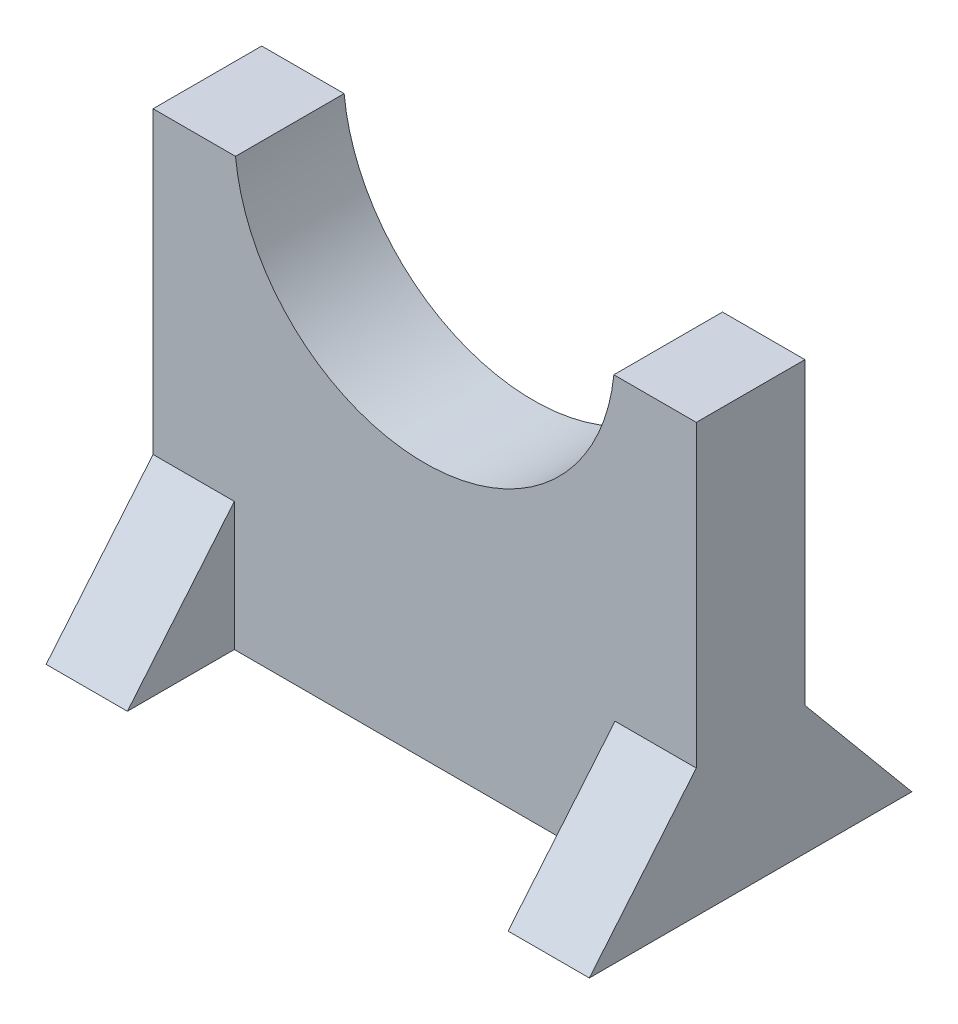
ISO-10303-21;
HEADER;
FILE_DESCRIPTION(('STEP AP214'),'2;1');
FILE_NAME('part.step','',(''),(''),'','','');
FILE_SCHEMA(('AUTOMOTIVE_DESIGN { 1 0 10303 214 1 1 1 1 }'));
ENDSEC;
DATA;
#1=APPLICATION_CONTEXT('core data for automotive mechanical design processes');
#2=APPLICATION_PROTOCOL_DEFINITION('international standard','automotive_design',2000,#1);
#3=PRODUCT_CONTEXT('',#1,'mechanical');
#4=PRODUCT('Part','Part','',(#3));
#5=PRODUCT_RELATED_PRODUCT_CATEGORY('part','',(#4));
#6=PRODUCT_DEFINITION_FORMATION('','',#4);
#7=PRODUCT_DEFINITION_CONTEXT('part definition',#1,'design');
#8=PRODUCT_DEFINITION('design','',#6,#7);
#9=PRODUCT_DEFINITION_SHAPE('','',#8);
#10=(LENGTH_UNIT() NAMED_UNIT(*) SI_UNIT(.MILLI.,.METRE.));
#11=(NAMED_UNIT(*) PLANE_ANGLE_UNIT() SI_UNIT($,.RADIAN.));
#12=(NAMED_UNIT(*) SI_UNIT($,.STERADIAN.) SOLID_ANGLE_UNIT());
#13=UNCERTAINTY_MEASURE_WITH_UNIT(LENGTH_MEASURE(1.E-05),#10,'distance_accuracy_value','');
#14=(GEOMETRIC_REPRESENTATION_CONTEXT(3) GLOBAL_UNCERTAINTY_ASSIGNED_CONTEXT((#13)) GLOBAL_UNIT_ASSIGNED_CONTEXT((#10,
#11,#12)) REPRESENTATION_CONTEXT('',''));
#15=CARTESIAN_POINT('',(0.,0.,0.));
#16=DIRECTION('',(0.,0.,1.));
#17=DIRECTION('',(1.,0.,0.));
#18=AXIS2_PLACEMENT_3D('',#15,#16,#17);
#19=CARTESIAN_POINT('',(-63.5,100.,12.7));
#20=DIRECTION('',(0.,0.,-1.));
#21=DIRECTION('',(-1.,0.,0.));
#22=AXIS2_PLACEMENT_3D('',#19,#20,#21);
#23=PLANE('',#22);
#24=DIRECTION('',(0.,-1.,0.));
#25=VECTOR('',#24,1.);
#26=CARTESIAN_POINT('',(44.5,30.,12.7));
#27=LINE('',#26,#25);
#28=CARTESIAN_POINT('',(44.5,30.,12.7));
#29=VERTEX_POINT('',#28);
#30=CARTESIAN_POINT('',(44.5,0.,12.7));
#31=VERTEX_POINT('',#30);
#32=EDGE_CURVE('E206',#29,#31,#27,.T.);
#33=ORIENTED_EDGE('',*,*,#32,.F.);
#34=DIRECTION('',(-1.,0.,0.));
#35=VECTOR('',#34,1.);
#36=CARTESIAN_POINT('',(63.5,30.,12.7));
#37=LINE('',#36,#35);
#38=CARTESIAN_POINT('',(63.5,30.,12.7));
#39=VERTEX_POINT('',#38);
#40=EDGE_CURVE('E219',#39,#29,#37,.T.);
#41=ORIENTED_EDGE('',*,*,#40,.F.);
#42=DIRECTION('',(0.,-1.,0.));
#43=VECTOR('',#42,1.);
#44=CARTESIAN_POINT('',(63.5,100.,12.7));
#45=LINE('',#44,#43);
#46=CARTESIAN_POINT('',(63.5,100.,12.7));
#47=VERTEX_POINT('',#46);
#48=EDGE_CURVE('E159',#47,#39,#45,.T.);
#49=ORIENTED_EDGE('',*,*,#48,.F.);
#50=DIRECTION('',(1.,0.,0.));
#51=VECTOR('',#50,1.);
#52=CARTESIAN_POINT('',(-63.5,100.,12.7));
#53=LINE('',#52,#51);
#54=CARTESIAN_POINT('',(44.226688774992,100.,12.7));
#55=VERTEX_POINT('',#54);
#56=EDGE_CURVE('E195',#55,#47,#53,.T.);
#57=ORIENTED_EDGE('',*,*,#56,.F.);
#58=CARTESIAN_POINT('',(0.,104.45,12.7));
#59=DIRECTION('',(0.,0.,1.));
#60=DIRECTION('',(1.,0.,0.));
#61=AXIS2_PLACEMENT_3D('',#58,#59,#60);
#62=CIRCLE('',#61,44.45);
#63=CARTESIAN_POINT('',(-44.226688774992,100.,12.7));
#64=VERTEX_POINT('',#63);
#65=EDGE_CURVE('E175',#64,#55,#62,.T.);
#66=ORIENTED_EDGE('',*,*,#65,.F.);
#67=CARTESIAN_POINT('',(-63.5,100.,12.7));
#68=VERTEX_POINT('',#67);
#69=EDGE_CURVE('E157',#68,#64,#53,.T.);
#70=ORIENTED_EDGE('',*,*,#69,.F.);
#71=DIRECTION('',(0.,-1.,0.));
#72=VECTOR('',#71,1.);
#73=CARTESIAN_POINT('',(-63.5,100.,12.7));
#74=LINE('',#73,#72);
#75=CARTESIAN_POINT('',(-63.5,30.,12.7));
#76=VERTEX_POINT('',#75);
#77=EDGE_CURVE('E146',#68,#76,#74,.T.);
#78=ORIENTED_EDGE('',*,*,#77,.T.);
#79=DIRECTION('',(-1.,0.,0.));
#80=VECTOR('',#79,1.);
#81=CARTESIAN_POINT('',(-63.5,30.,12.7));
#82=LINE('',#81,#80);
#83=CARTESIAN_POINT('',(-44.5,30.,12.7));
#84=VERTEX_POINT('',#83);
#85=EDGE_CURVE('E130',#84,#76,#82,.T.);
#86=ORIENTED_EDGE('',*,*,#85,.F.);
#87=DIRECTION('',(0.,-1.,0.));
#88=VECTOR('',#87,1.);
#89=CARTESIAN_POINT('',(-44.5,30.,12.7));
#90=LINE('',#89,#88);
#91=CARTESIAN_POINT('',(-44.5,0.,12.7));
#92=VERTEX_POINT('',#91);
#93=EDGE_CURVE('E139',#84,#92,#90,.T.);
#94=ORIENTED_EDGE('',*,*,#93,.T.);
#95=DIRECTION('',(1.,0.,0.));
#96=VECTOR('',#95,1.);
#97=CARTESIAN_POINT('',(-63.5,0.,12.7));
#98=LINE('',#97,#96);
#99=EDGE_CURVE('E204',#92,#31,#98,.T.);
#100=ORIENTED_EDGE('',*,*,#99,.T.);
#101=EDGE_LOOP('',(#33,#41,#49,#57,#66,#70,#78,#86,#94,#100));
#102=FACE_BOUND('',#101,.T.);
#103=ADVANCED_FACE('F33',(#102),#23,.F.);
#104=CARTESIAN_POINT('',(-63.5,100.,-12.7));
#105=DIRECTION('',(0.,0.,1.));
#106=DIRECTION('',(1.,0.,0.));
#107=AXIS2_PLACEMENT_3D('',#104,#105,#106);
#108=PLANE('',#107);
#109=DIRECTION('',(0.,-1.,0.));
#110=VECTOR('',#109,1.);
#111=CARTESIAN_POINT('',(-44.5,30.,-12.7));
#112=LINE('',#111,#110);
#113=CARTESIAN_POINT('',(-44.5,30.,-12.7));
#114=VERTEX_POINT('',#113);
#115=CARTESIAN_POINT('',(-44.5,0.,-12.7));
#116=VERTEX_POINT('',#115);
#117=EDGE_CURVE('E241',#114,#116,#112,.T.);
#118=ORIENTED_EDGE('',*,*,#117,.F.);
#119=DIRECTION('',(1.,0.,0.));
#120=VECTOR('',#119,1.);
#121=CARTESIAN_POINT('',(-63.5,30.,-12.7));
#122=LINE('',#121,#120);
#123=CARTESIAN_POINT('',(-63.5,30.,-12.7));
#124=VERTEX_POINT('',#123);
#125=EDGE_CURVE('E239',#124,#114,#122,.T.);
#126=ORIENTED_EDGE('',*,*,#125,.F.);
#127=DIRECTION('',(0.,-1.,0.));
#128=VECTOR('',#127,1.);
#129=CARTESIAN_POINT('',(-63.5,100.,-12.7));
#130=LINE('',#129,#128);
#131=CARTESIAN_POINT('',(-63.5,100.,-12.7));
#132=VERTEX_POINT('',#131);
#133=EDGE_CURVE('E158',#132,#124,#130,.T.);
#134=ORIENTED_EDGE('',*,*,#133,.F.);
#135=DIRECTION('',(-1.,0.,0.));
#136=VECTOR('',#135,1.);
#137=CARTESIAN_POINT('',(-63.5,100.,-12.7));
#138=LINE('',#137,#136);
#139=CARTESIAN_POINT('',(-44.226688774992,100.,-12.7));
#140=VERTEX_POINT('',#139);
#141=EDGE_CURVE('E186',#140,#132,#138,.T.);
#142=ORIENTED_EDGE('',*,*,#141,.F.);
#143=CARTESIAN_POINT('',(0.,104.45,-12.7));
#144=DIRECTION('',(0.,0.,1.));
#145=DIRECTION('',(1.,0.,0.));
#146=AXIS2_PLACEMENT_3D('',#143,#144,#145);
#147=CIRCLE('',#146,44.45);
#148=CARTESIAN_POINT('',(44.226688774992,100.,-12.7));
#149=VERTEX_POINT('',#148);
#150=EDGE_CURVE('E173',#140,#149,#147,.T.);
#151=ORIENTED_EDGE('',*,*,#150,.T.);
#152=CARTESIAN_POINT('',(63.5,100.,-12.7));
#153=VERTEX_POINT('',#152);
#154=EDGE_CURVE('E183',#153,#149,#138,.T.);
#155=ORIENTED_EDGE('',*,*,#154,.F.);
#156=DIRECTION('',(0.,-1.,0.));
#157=VECTOR('',#156,1.);
#158=CARTESIAN_POINT('',(63.5,100.,-12.7));
#159=LINE('',#158,#157);
#160=CARTESIAN_POINT('',(63.5,30.,-12.7));
#161=VERTEX_POINT('',#160);
#162=EDGE_CURVE('E162',#153,#161,#159,.T.);
#163=ORIENTED_EDGE('',*,*,#162,.T.);
#164=DIRECTION('',(1.,0.,0.));
#165=VECTOR('',#164,1.);
#166=CARTESIAN_POINT('',(63.5,30.,-12.7));
#167=LINE('',#166,#165);
#168=CARTESIAN_POINT('',(44.5,30.,-12.7));
#169=VERTEX_POINT('',#168);
#170=EDGE_CURVE('E229',#169,#161,#167,.T.);
#171=ORIENTED_EDGE('',*,*,#170,.F.);
#172=DIRECTION('',(0.,-1.,0.));
#173=VECTOR('',#172,1.);
#174=CARTESIAN_POINT('',(44.5,30.,-12.7));
#175=LINE('',#174,#173);
#176=CARTESIAN_POINT('',(44.5,0.,-12.7));
#177=VERTEX_POINT('',#176);
#178=EDGE_CURVE('E231',#169,#177,#175,.T.);
#179=ORIENTED_EDGE('',*,*,#178,.T.);
#180=DIRECTION('',(-1.,0.,0.));
#181=VECTOR('',#180,1.);
#182=CARTESIAN_POINT('',(-63.5,0.,-12.7));
#183=LINE('',#182,#181);
#184=EDGE_CURVE('E202',#177,#116,#183,.T.);
#185=ORIENTED_EDGE('',*,*,#184,.T.);
#186=EDGE_LOOP('',(#118,#126,#134,#142,#151,#155,#163,#171,#179,#185));
#187=FACE_BOUND('',#186,.T.);
#188=ADVANCED_FACE('F182',(#187),#108,.F.);
#189=CARTESIAN_POINT('',(0.,100.,0.));
#190=DIRECTION('',(0.,1.,0.));
#191=DIRECTION('',(0.,0.,1.));
#192=AXIS2_PLACEMENT_3D('',#189,#190,#191);
#193=PLANE('',#192);
#194=DIRECTION('',(0.,0.,1.));
#195=VECTOR('',#194,1.);
#196=CARTESIAN_POINT('',(-44.226688774992,100.,-17.3));
#197=LINE('',#196,#195);
#198=EDGE_CURVE('E11',#140,#64,#197,.T.);
#199=ORIENTED_EDGE('',*,*,#198,.F.);
#200=ORIENTED_EDGE('',*,*,#141,.T.);
#201=DIRECTION('',(0.,0.,1.));
#202=VECTOR('',#201,1.);
#203=CARTESIAN_POINT('',(-63.5,100.,-12.7));
#204=LINE('',#203,#202);
#205=EDGE_CURVE('E193',#132,#68,#204,.T.);
#206=ORIENTED_EDGE('',*,*,#205,.T.);
#207=ORIENTED_EDGE('',*,*,#69,.T.);
#208=EDGE_LOOP('',(#199,#200,#206,#207));
#209=FACE_BOUND('',#208,.T.);
#210=ADVANCED_FACE('F290',(#209),#193,.T.);
#211=CARTESIAN_POINT('',(63.5,100.,-12.7));
#212=DIRECTION('',(-1.,0.,0.));
#213=DIRECTION('',(0.,0.,1.));
#214=AXIS2_PLACEMENT_3D('',#211,#212,#213);
#215=PLANE('',#214);
#216=ORIENTED_EDGE('',*,*,#48,.T.);
#217=DIRECTION('',(0.,-0.768221279597376,0.64018439966448));
#218=VECTOR('',#217,1.);
#219=CARTESIAN_POINT('',(63.5,83.8032786885246,-32.1360655737705));
#220=LINE('',#219,#218);
#221=CARTESIAN_POINT('',(63.5,0.,37.7));
#222=VERTEX_POINT('',#221);
#223=EDGE_CURVE('E56',#39,#222,#220,.T.);
#224=ORIENTED_EDGE('',*,*,#223,.T.);
#225=DIRECTION('',(0.,0.,-1.));
#226=VECTOR('',#225,1.);
#227=CARTESIAN_POINT('',(63.5,0.,-12.7));
#228=LINE('',#227,#226);
#229=CARTESIAN_POINT('',(63.5,0.,-37.7));
#230=VERTEX_POINT('',#229);
#231=EDGE_CURVE('E187',#222,#230,#228,.T.);
#232=ORIENTED_EDGE('',*,*,#231,.T.);
#233=DIRECTION('',(0.,0.768221279597376,0.64018439966448));
#234=VECTOR('',#233,1.);
#235=CARTESIAN_POINT('',(63.5,71.3114754098361,21.7262295081967));
#236=LINE('',#235,#234);
#237=EDGE_CURVE('E267',#230,#161,#236,.T.);
#238=ORIENTED_EDGE('',*,*,#237,.T.);
#239=ORIENTED_EDGE('',*,*,#162,.F.);
#240=DIRECTION('',(0.,0.,-1.));
#241=VECTOR('',#240,1.);
#242=CARTESIAN_POINT('',(63.5,100.,-12.7));
#243=LINE('',#242,#241);
#244=EDGE_CURVE('E191',#47,#153,#243,.T.);
#245=ORIENTED_EDGE('',*,*,#244,.F.);
#246=EDGE_LOOP('',(#216,#224,#232,#238,#239,#245));
#247=FACE_BOUND('',#246,.T.);
#248=ADVANCED_FACE('F35',(#247),#215,.F.);
#249=CARTESIAN_POINT('',(-63.5,100.,-12.7));
#250=DIRECTION('',(1.,0.,0.));
#251=DIRECTION('',(0.,0.,-1.));
#252=AXIS2_PLACEMENT_3D('',#249,#250,#251);
#253=PLANE('',#252);
#254=DIRECTION('',(0.,0.,1.));
#255=VECTOR('',#254,1.);
#256=CARTESIAN_POINT('',(-63.5,0.,-12.7));
#257=LINE('',#256,#255);
#258=CARTESIAN_POINT('',(-63.5,0.,-37.7));
#259=VERTEX_POINT('',#258);
#260=CARTESIAN_POINT('',(-63.5,0.,37.7));
#261=VERTEX_POINT('',#260);
#262=EDGE_CURVE('E150',#259,#261,#257,.T.);
#263=ORIENTED_EDGE('',*,*,#262,.T.);
#264=DIRECTION('',(0.,-0.768221279597376,0.64018439966448));
#265=VECTOR('',#264,1.);
#266=CARTESIAN_POINT('',(-63.5,30.,12.7));
#267=LINE('',#266,#265);
#268=EDGE_CURVE('E133',#76,#261,#267,.T.);
#269=ORIENTED_EDGE('',*,*,#268,.F.);
#270=ORIENTED_EDGE('',*,*,#77,.F.);
#271=ORIENTED_EDGE('',*,*,#205,.F.);
#272=ORIENTED_EDGE('',*,*,#133,.T.);
#273=DIRECTION('',(0.,0.768221279597376,0.64018439966448));
#274=VECTOR('',#273,1.);
#275=CARTESIAN_POINT('',(-63.5,30.,-12.7));
#276=LINE('',#275,#274);
#277=EDGE_CURVE('E152',#259,#124,#276,.T.);
#278=ORIENTED_EDGE('',*,*,#277,.F.);
#279=EDGE_LOOP('',(#263,#269,#270,#271,#272,#278));
#280=FACE_BOUND('',#279,.T.);
#281=ADVANCED_FACE('F144',(#280),#253,.F.);
#282=DIRECTION('',(0.,0.,1.));
#283=VECTOR('',#282,1.);
#284=CARTESIAN_POINT('',(44.226688774992,100.,-17.3));
#285=LINE('',#284,#283);
#286=EDGE_CURVE('E41',#55,#149,#285,.F.);
#287=ORIENTED_EDGE('',*,*,#286,.F.);
#288=ORIENTED_EDGE('',*,*,#56,.T.);
#289=ORIENTED_EDGE('',*,*,#244,.T.);
#290=ORIENTED_EDGE('',*,*,#154,.T.);
#291=EDGE_LOOP('',(#287,#288,#289,#290));
#292=FACE_BOUND('',#291,.T.);
#293=ADVANCED_FACE('F189',(#292),#193,.T.);
#294=CARTESIAN_POINT('',(0.,0.,0.));
#295=DIRECTION('',(0.,1.,0.));
#296=DIRECTION('',(0.,0.,1.));
#297=AXIS2_PLACEMENT_3D('',#294,#295,#296);
#298=PLANE('',#297);
#299=ORIENTED_EDGE('',*,*,#231,.F.);
#300=DIRECTION('',(1.,0.,0.));
#301=VECTOR('',#300,1.);
#302=CARTESIAN_POINT('',(63.5,0.,37.7));
#303=LINE('',#302,#301);
#304=CARTESIAN_POINT('',(44.5,0.,37.7));
#305=VERTEX_POINT('',#304);
#306=EDGE_CURVE('E223',#305,#222,#303,.T.);
#307=ORIENTED_EDGE('',*,*,#306,.F.);
#308=DIRECTION('',(0.,0.,1.));
#309=VECTOR('',#308,1.);
#310=CARTESIAN_POINT('',(44.5,0.,12.7));
#311=LINE('',#310,#309);
#312=EDGE_CURVE('E215',#31,#305,#311,.T.);
#313=ORIENTED_EDGE('',*,*,#312,.F.);
#314=ORIENTED_EDGE('',*,*,#99,.F.);
#315=DIRECTION('',(0.,0.,-1.));
#316=VECTOR('',#315,1.);
#317=CARTESIAN_POINT('',(-44.5,0.,12.7));
#318=LINE('',#317,#316);
#319=CARTESIAN_POINT('',(-44.5,0.,37.7));
#320=VERTEX_POINT('',#319);
#321=EDGE_CURVE('E140',#320,#92,#318,.T.);
#322=ORIENTED_EDGE('',*,*,#321,.F.);
#323=DIRECTION('',(1.,0.,0.));
#324=VECTOR('',#323,1.);
#325=CARTESIAN_POINT('',(-63.5,0.,37.7));
#326=LINE('',#325,#324);
#327=EDGE_CURVE('E269',#261,#320,#326,.T.);
#328=ORIENTED_EDGE('',*,*,#327,.F.);
#329=ORIENTED_EDGE('',*,*,#262,.F.);
#330=DIRECTION('',(-1.,0.,0.));
#331=VECTOR('',#330,1.);
#332=CARTESIAN_POINT('',(-63.5,0.,-37.7));
#333=LINE('',#332,#331);
#334=CARTESIAN_POINT('',(-44.5,0.,-37.7));
#335=VERTEX_POINT('',#334);
#336=EDGE_CURVE('E242',#335,#259,#333,.T.);
#337=ORIENTED_EDGE('',*,*,#336,.F.);
#338=DIRECTION('',(0.,0.,-1.));
#339=VECTOR('',#338,1.);
#340=CARTESIAN_POINT('',(-44.5,0.,-12.7));
#341=LINE('',#340,#339);
#342=EDGE_CURVE('E238',#116,#335,#341,.T.);
#343=ORIENTED_EDGE('',*,*,#342,.F.);
#344=ORIENTED_EDGE('',*,*,#184,.F.);
#345=DIRECTION('',(0.,0.,1.));
#346=VECTOR('',#345,1.);
#347=CARTESIAN_POINT('',(44.5,0.,-12.7));
#348=LINE('',#347,#346);
#349=CARTESIAN_POINT('',(44.5,0.,-37.7));
#350=VERTEX_POINT('',#349);
#351=EDGE_CURVE('E232',#350,#177,#348,.T.);
#352=ORIENTED_EDGE('',*,*,#351,.F.);
#353=DIRECTION('',(-1.,0.,0.));
#354=VECTOR('',#353,1.);
#355=CARTESIAN_POINT('',(63.5,0.,-37.7));
#356=LINE('',#355,#354);
#357=EDGE_CURVE('E218',#230,#350,#356,.T.);
#358=ORIENTED_EDGE('',*,*,#357,.F.);
#359=EDGE_LOOP('',(#299,#307,#313,#314,#322,#328,#329,#337,#343,#344,#352,#358));
#360=FACE_BOUND('',#359,.T.);
#361=ADVANCED_FACE('F222',(#360),#298,.F.);
#362=CARTESIAN_POINT('',(0.,104.45,-17.3));
#363=DIRECTION('',(0.,0.,1.));
#364=DIRECTION('',(1.,0.,0.));
#365=AXIS2_PLACEMENT_3D('',#362,#363,#364);
#366=CYLINDRICAL_SURFACE('',#365,44.45);
#367=ORIENTED_EDGE('',*,*,#198,.T.);
#368=ORIENTED_EDGE('',*,*,#65,.T.);
#369=ORIENTED_EDGE('',*,*,#286,.T.);
#370=ORIENTED_EDGE('',*,*,#150,.F.);
#371=EDGE_LOOP('',(#367,#368,#369,#370));
#372=FACE_BOUND('',#371,.T.);
#373=ADVANCED_FACE('F172',(#372),#366,.F.);
#374=CARTESIAN_POINT('',(-44.5,30.,-12.7));
#375=DIRECTION('',(-1.,0.,0.));
#376=DIRECTION('',(0.,0.,1.));
#377=AXIS2_PLACEMENT_3D('',#374,#375,#376);
#378=PLANE('',#377);
#379=ORIENTED_EDGE('',*,*,#342,.T.);
#380=DIRECTION('',(0.,0.768221279597376,0.64018439966448));
#381=VECTOR('',#380,1.);
#382=CARTESIAN_POINT('',(-44.5,30.,-12.7));
#383=LINE('',#382,#381);
#384=EDGE_CURVE('E253',#335,#114,#383,.T.);
#385=ORIENTED_EDGE('',*,*,#384,.T.);
#386=ORIENTED_EDGE('',*,*,#117,.T.);
#387=EDGE_LOOP('',(#379,#385,#386));
#388=FACE_BOUND('',#387,.T.);
#389=ADVANCED_FACE('F251',(#388),#378,.F.);
#390=CARTESIAN_POINT('',(44.5,30.,-12.7));
#391=DIRECTION('',(1.,0.,0.));
#392=DIRECTION('',(0.,0.,-1.));
#393=AXIS2_PLACEMENT_3D('',#390,#391,#392);
#394=PLANE('',#393);
#395=ORIENTED_EDGE('',*,*,#178,.F.);
#396=DIRECTION('',(0.,-0.768221279597376,-0.64018439966448));
#397=VECTOR('',#396,1.);
#398=CARTESIAN_POINT('',(44.5,30.,-12.7));
#399=LINE('',#398,#397);
#400=EDGE_CURVE('E263',#169,#350,#399,.T.);
#401=ORIENTED_EDGE('',*,*,#400,.T.);
#402=ORIENTED_EDGE('',*,*,#351,.T.);
#403=EDGE_LOOP('',(#395,#401,#402));
#404=FACE_BOUND('',#403,.T.);
#405=ADVANCED_FACE('F282',(#404),#394,.F.);
#406=CARTESIAN_POINT('',(44.5,30.,12.7));
#407=DIRECTION('',(1.,0.,0.));
#408=DIRECTION('',(0.,0.,-1.));
#409=AXIS2_PLACEMENT_3D('',#406,#407,#408);
#410=PLANE('',#409);
#411=ORIENTED_EDGE('',*,*,#312,.T.);
#412=DIRECTION('',(0.,0.768221279597376,-0.64018439966448));
#413=VECTOR('',#412,1.);
#414=CARTESIAN_POINT('',(44.5,30.,12.7));
#415=LINE('',#414,#413);
#416=EDGE_CURVE('E217',#305,#29,#415,.T.);
#417=ORIENTED_EDGE('',*,*,#416,.T.);
#418=ORIENTED_EDGE('',*,*,#32,.T.);
#419=EDGE_LOOP('',(#411,#417,#418));
#420=FACE_BOUND('',#419,.T.);
#421=ADVANCED_FACE('F214',(#420),#410,.F.);
#422=CARTESIAN_POINT('',(-44.5,30.,12.7));
#423=DIRECTION('',(-1.,0.,0.));
#424=DIRECTION('',(0.,0.,1.));
#425=AXIS2_PLACEMENT_3D('',#422,#423,#424);
#426=PLANE('',#425);
#427=ORIENTED_EDGE('',*,*,#93,.F.);
#428=DIRECTION('',(0.,-0.768221279597376,0.64018439966448));
#429=VECTOR('',#428,1.);
#430=CARTESIAN_POINT('',(-44.5,30.,12.7));
#431=LINE('',#430,#429);
#432=EDGE_CURVE('E48',#84,#320,#431,.T.);
#433=ORIENTED_EDGE('',*,*,#432,.T.);
#434=ORIENTED_EDGE('',*,*,#321,.T.);
#435=EDGE_LOOP('',(#427,#433,#434));
#436=FACE_BOUND('',#435,.T.);
#437=ADVANCED_FACE('F273',(#436),#426,.F.);
#438=CARTESIAN_POINT('',(76.5,30.,12.7));
#439=DIRECTION('',(0.,-0.64018439966448,-0.768221279597376));
#440=DIRECTION('',(0.,0.768221279597376,-0.64018439966448));
#441=AXIS2_PLACEMENT_3D('',#438,#439,#440);
#442=PLANE('',#441);
#443=ORIENTED_EDGE('',*,*,#85,.T.);
#444=ORIENTED_EDGE('',*,*,#268,.T.);
#445=ORIENTED_EDGE('',*,*,#327,.T.);
#446=ORIENTED_EDGE('',*,*,#432,.F.);
#447=EDGE_LOOP('',(#443,#444,#445,#446));
#448=FACE_BOUND('',#447,.T.);
#449=ADVANCED_FACE('F132',(#448),#442,.F.);
#450=ORIENTED_EDGE('',*,*,#40,.T.);
#451=ORIENTED_EDGE('',*,*,#416,.F.);
#452=ORIENTED_EDGE('',*,*,#306,.T.);
#453=ORIENTED_EDGE('',*,*,#223,.F.);
#454=EDGE_LOOP('',(#450,#451,#452,#453));
#455=FACE_BOUND('',#454,.T.);
#456=ADVANCED_FACE('F280',(#455),#442,.F.);
#457=CARTESIAN_POINT('',(76.5,30.,-12.7));
#458=DIRECTION('',(0.,-0.64018439966448,0.768221279597376));
#459=DIRECTION('',(0.,-0.768221279597376,-0.64018439966448));
#460=AXIS2_PLACEMENT_3D('',#457,#458,#459);
#461=PLANE('',#460);
#462=ORIENTED_EDGE('',*,*,#357,.T.);
#463=ORIENTED_EDGE('',*,*,#400,.F.);
#464=ORIENTED_EDGE('',*,*,#170,.T.);
#465=ORIENTED_EDGE('',*,*,#237,.F.);
#466=EDGE_LOOP('',(#462,#463,#464,#465));
#467=FACE_BOUND('',#466,.T.);
#468=ADVANCED_FACE('F306',(#467),#461,.F.);
#469=ORIENTED_EDGE('',*,*,#336,.T.);
#470=ORIENTED_EDGE('',*,*,#277,.T.);
#471=ORIENTED_EDGE('',*,*,#125,.T.);
#472=ORIENTED_EDGE('',*,*,#384,.F.);
#473=EDGE_LOOP('',(#469,#470,#471,#472));
#474=FACE_BOUND('',#473,.T.);
#475=ADVANCED_FACE('F257',(#474),#461,.F.);
#476=CLOSED_SHELL('',(#103,#188,#210,#248,#281,#293,#361,#373,#389,#405,#421,#437,#449,#456,
#468,#475));
#477=MANIFOLD_SOLID_BREP('B2',#476);
#478=ADVANCED_BREP_SHAPE_REPRESENTATION('',(#18,#477),#14);
#479=SHAPE_DEFINITION_REPRESENTATION(#9,#478);
ENDSEC;
END-ISO-10303-21;
